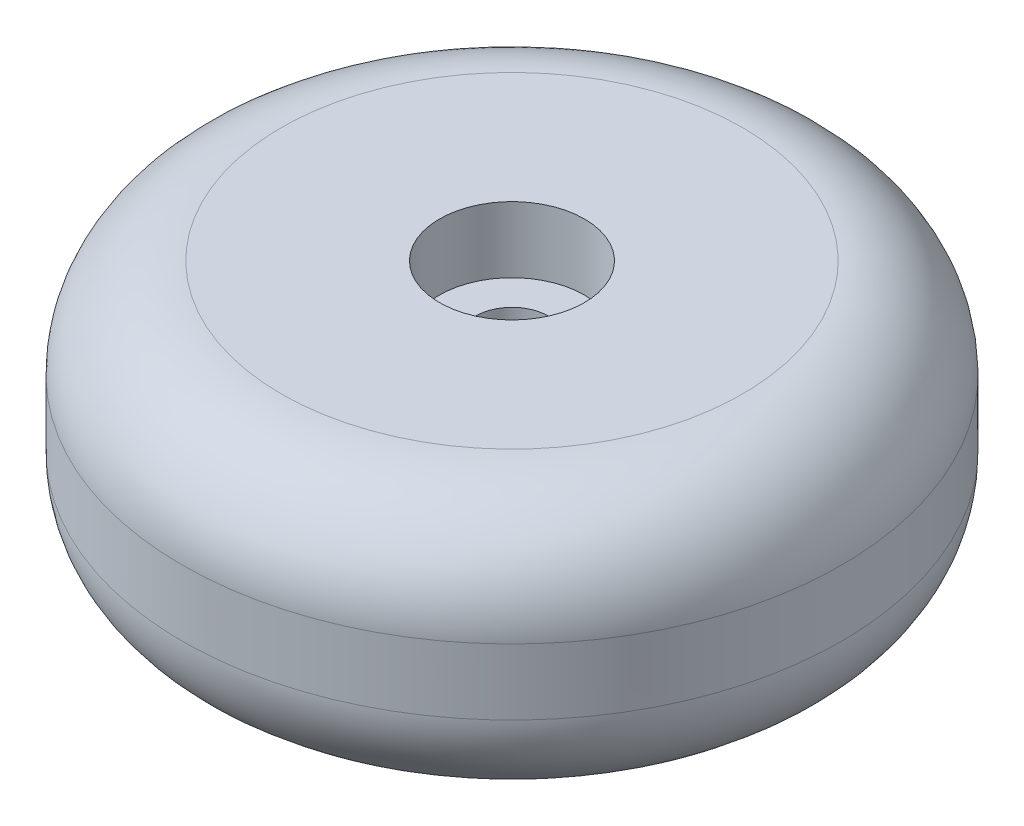
ISO-10303-21;
HEADER;
FILE_DESCRIPTION(('STEP AP214'),'2;1');
FILE_NAME('part.step','',(''),(''),'','','');
FILE_SCHEMA(('AUTOMOTIVE_DESIGN { 1 0 10303 214 1 1 1 1 }'));
ENDSEC;
DATA;
#1=APPLICATION_CONTEXT('core data for automotive mechanical design processes');
#2=APPLICATION_PROTOCOL_DEFINITION('international standard','automotive_design',2000,#1);
#3=PRODUCT_CONTEXT('',#1,'mechanical');
#4=PRODUCT('Part','Part','',(#3));
#5=PRODUCT_RELATED_PRODUCT_CATEGORY('part','',(#4));
#6=PRODUCT_DEFINITION_FORMATION('','',#4);
#7=PRODUCT_DEFINITION_CONTEXT('part definition',#1,'design');
#8=PRODUCT_DEFINITION('design','',#6,#7);
#9=PRODUCT_DEFINITION_SHAPE('','',#8);
#10=(LENGTH_UNIT() NAMED_UNIT(*) SI_UNIT(.MILLI.,.METRE.));
#11=(NAMED_UNIT(*) PLANE_ANGLE_UNIT() SI_UNIT($,.RADIAN.));
#12=(NAMED_UNIT(*) SI_UNIT($,.STERADIAN.) SOLID_ANGLE_UNIT());
#13=UNCERTAINTY_MEASURE_WITH_UNIT(LENGTH_MEASURE(1.E-05),#10,'distance_accuracy_value','');
#14=(GEOMETRIC_REPRESENTATION_CONTEXT(3) GLOBAL_UNCERTAINTY_ASSIGNED_CONTEXT((#13)) GLOBAL_UNIT_ASSIGNED_CONTEXT((#10,
#11,#12)) REPRESENTATION_CONTEXT('',''));
#15=CARTESIAN_POINT('',(0.,0.,0.));
#16=DIRECTION('',(0.,0.,1.));
#17=DIRECTION('',(1.,0.,0.));
#18=AXIS2_PLACEMENT_3D('',#15,#16,#17);
#19=CARTESIAN_POINT('',(20.,16.,0.));
#20=DIRECTION('',(0.,1.,0.));
#21=DIRECTION('',(0.,0.,1.));
#22=AXIS2_PLACEMENT_3D('',#19,#20,#21);
#23=PLANE('',#22);
#24=CARTESIAN_POINT('',(0.,16.,0.));
#25=DIRECTION('',(0.,1.,0.));
#26=DIRECTION('',(0.,0.,1.));
#27=AXIS2_PLACEMENT_3D('',#24,#25,#26);
#28=CIRCLE('',#27,14.);
#29=CARTESIAN_POINT('',(0.,16.,14.));
#30=VERTEX_POINT('',#29);
#31=EDGE_CURVE('E10',#30,#30,#28,.T.);
#32=ORIENTED_EDGE('',*,*,#31,.T.);
#33=EDGE_LOOP('',(#32));
#34=FACE_BOUND('',#33,.T.);
#35=CARTESIAN_POINT('',(0.,16.,0.));
#36=DIRECTION('',(0.,-1.,0.));
#37=DIRECTION('',(0.,0.,-1.));
#38=AXIS2_PLACEMENT_3D('',#35,#36,#37);
#39=CIRCLE('',#38,4.4);
#40=CARTESIAN_POINT('',(0.,16.,-4.4));
#41=VERTEX_POINT('',#40);
#42=EDGE_CURVE('E51',#41,#41,#39,.T.);
#43=ORIENTED_EDGE('',*,*,#42,.T.);
#44=EDGE_LOOP('',(#43));
#45=FACE_BOUND('',#44,.T.);
#46=ADVANCED_FACE('F31',(#34,#45),#23,.T.);
#47=CARTESIAN_POINT('',(0.,0.,0.));
#48=DIRECTION('',(0.,-1.,0.));
#49=DIRECTION('',(0.,0.,-1.));
#50=AXIS2_PLACEMENT_3D('',#47,#48,#49);
#51=CYLINDRICAL_SURFACE('',#50,4.4);
#52=CARTESIAN_POINT('',(0.,12.,0.));
#53=DIRECTION('',(0.,-1.,0.));
#54=DIRECTION('',(0.,0.,-1.));
#55=AXIS2_PLACEMENT_3D('',#52,#53,#54);
#56=CIRCLE('',#55,4.4);
#57=CARTESIAN_POINT('',(0.,12.,-4.4));
#58=VERTEX_POINT('',#57);
#59=EDGE_CURVE('E54',#58,#58,#56,.T.);
#60=ORIENTED_EDGE('',*,*,#59,.T.);
#61=EDGE_LOOP('',(#60));
#62=FACE_BOUND('',#61,.T.);
#63=ORIENTED_EDGE('',*,*,#42,.F.);
#64=EDGE_LOOP('',(#63));
#65=FACE_BOUND('',#64,.T.);
#66=ADVANCED_FACE('F81',(#62,#65),#51,.F.);
#67=CARTESIAN_POINT('',(4.4,12.,0.));
#68=DIRECTION('',(0.,1.,0.));
#69=DIRECTION('',(0.,0.,1.));
#70=AXIS2_PLACEMENT_3D('',#67,#68,#69);
#71=PLANE('',#70);
#72=CARTESIAN_POINT('',(0.,12.,0.));
#73=DIRECTION('',(0.,-1.,0.));
#74=DIRECTION('',(0.,0.,-1.));
#75=AXIS2_PLACEMENT_3D('',#72,#73,#74);
#76=CIRCLE('',#75,2.2);
#77=CARTESIAN_POINT('',(0.,12.,-2.2));
#78=VERTEX_POINT('',#77);
#79=EDGE_CURVE('E57',#78,#78,#76,.T.);
#80=ORIENTED_EDGE('',*,*,#79,.T.);
#81=EDGE_LOOP('',(#80));
#82=FACE_BOUND('',#81,.T.);
#83=ORIENTED_EDGE('',*,*,#59,.F.);
#84=EDGE_LOOP('',(#83));
#85=FACE_BOUND('',#84,.T.);
#86=ADVANCED_FACE('F78',(#82,#85),#71,.T.);
#87=CARTESIAN_POINT('',(0.,0.,0.));
#88=DIRECTION('',(0.,-1.,0.));
#89=DIRECTION('',(0.,0.,-1.));
#90=AXIS2_PLACEMENT_3D('',#87,#88,#89);
#91=CYLINDRICAL_SURFACE('',#90,2.2);
#92=CARTESIAN_POINT('',(0.,0.,0.));
#93=DIRECTION('',(0.,-1.,0.));
#94=DIRECTION('',(0.,0.,-1.));
#95=AXIS2_PLACEMENT_3D('',#92,#93,#94);
#96=CIRCLE('',#95,2.2);
#97=CARTESIAN_POINT('',(0.,0.,-2.2));
#98=VERTEX_POINT('',#97);
#99=EDGE_CURVE('E60',#98,#98,#96,.T.);
#100=ORIENTED_EDGE('',*,*,#99,.T.);
#101=EDGE_LOOP('',(#100));
#102=FACE_BOUND('',#101,.T.);
#103=ORIENTED_EDGE('',*,*,#79,.F.);
#104=EDGE_LOOP('',(#103));
#105=FACE_BOUND('',#104,.T.);
#106=ADVANCED_FACE('F64',(#102,#105),#91,.F.);
#107=CARTESIAN_POINT('',(2.2,0.,0.));
#108=DIRECTION('',(0.,-1.,0.));
#109=DIRECTION('',(0.,0.,-1.));
#110=AXIS2_PLACEMENT_3D('',#107,#108,#109);
#111=PLANE('',#110);
#112=CARTESIAN_POINT('',(0.,0.,0.));
#113=DIRECTION('',(0.,-1.,0.));
#114=DIRECTION('',(0.,0.,-1.));
#115=AXIS2_PLACEMENT_3D('',#112,#113,#114);
#116=CIRCLE('',#115,14.);
#117=CARTESIAN_POINT('',(0.,0.,-14.));
#118=VERTEX_POINT('',#117);
#119=EDGE_CURVE('E46',#118,#118,#116,.T.);
#120=ORIENTED_EDGE('',*,*,#119,.T.);
#121=EDGE_LOOP('',(#120));
#122=FACE_BOUND('',#121,.T.);
#123=ORIENTED_EDGE('',*,*,#99,.F.);
#124=EDGE_LOOP('',(#123));
#125=FACE_BOUND('',#124,.T.);
#126=ADVANCED_FACE('F67',(#122,#125),#111,.T.);
#127=CARTESIAN_POINT('',(0.,0.,0.));
#128=DIRECTION('',(0.,-1.,0.));
#129=DIRECTION('',(0.,0.,-1.));
#130=AXIS2_PLACEMENT_3D('',#127,#128,#129);
#131=CYLINDRICAL_SURFACE('',#130,20.);
#132=CARTESIAN_POINT('',(0.,6.,0.));
#133=DIRECTION('',(0.,-1.,0.));
#134=DIRECTION('',(0.,0.,-1.));
#135=AXIS2_PLACEMENT_3D('',#132,#133,#134);
#136=CIRCLE('',#135,20.);
#137=CARTESIAN_POINT('',(0.,6.,-20.));
#138=VERTEX_POINT('',#137);
#139=EDGE_CURVE('E38',#138,#138,#136,.F.);
#140=ORIENTED_EDGE('',*,*,#139,.T.);
#141=EDGE_LOOP('',(#140));
#142=FACE_BOUND('',#141,.T.);
#143=CARTESIAN_POINT('',(0.,10.,0.));
#144=DIRECTION('',(0.,1.,0.));
#145=DIRECTION('',(0.,0.,1.));
#146=AXIS2_PLACEMENT_3D('',#143,#144,#145);
#147=CIRCLE('',#146,20.);
#148=CARTESIAN_POINT('',(0.,10.,20.));
#149=VERTEX_POINT('',#148);
#150=EDGE_CURVE('E42',#149,#149,#147,.F.);
#151=ORIENTED_EDGE('',*,*,#150,.T.);
#152=EDGE_LOOP('',(#151));
#153=FACE_BOUND('',#152,.T.);
#154=ADVANCED_FACE('F69',(#142,#153),#131,.T.);
#155=CARTESIAN_POINT('',(0.,6.,0.));
#156=DIRECTION('',(0.,-1.,0.));
#157=DIRECTION('',(0.,0.,-1.));
#158=AXIS2_PLACEMENT_3D('',#155,#156,#157);
#159=TOROIDAL_SURFACE('',#158,14.,6.);
#160=ORIENTED_EDGE('',*,*,#139,.F.);
#161=EDGE_LOOP('',(#160));
#162=FACE_BOUND('',#161,.T.);
#163=ORIENTED_EDGE('',*,*,#119,.F.);
#164=EDGE_LOOP('',(#163));
#165=FACE_BOUND('',#164,.T.);
#166=ADVANCED_FACE('F76',(#162,#165),#159,.T.);
#167=CARTESIAN_POINT('',(0.,10.,0.));
#168=DIRECTION('',(0.,1.,0.));
#169=DIRECTION('',(0.,0.,1.));
#170=AXIS2_PLACEMENT_3D('',#167,#168,#169);
#171=TOROIDAL_SURFACE('',#170,14.,6.);
#172=ORIENTED_EDGE('',*,*,#31,.F.);
#173=EDGE_LOOP('',(#172));
#174=FACE_BOUND('',#173,.T.);
#175=ORIENTED_EDGE('',*,*,#150,.F.);
#176=EDGE_LOOP('',(#175));
#177=FACE_BOUND('',#176,.T.);
#178=ADVANCED_FACE('F33',(#174,#177),#171,.T.);
#179=CLOSED_SHELL('',(#46,#66,#86,#106,#126,#154,#166,#178));
#180=MANIFOLD_SOLID_BREP('B2',#179);
#181=ADVANCED_BREP_SHAPE_REPRESENTATION('',(#18,#180),#14);
#182=SHAPE_DEFINITION_REPRESENTATION(#9,#181);
ENDSEC;
END-ISO-10303-21;
